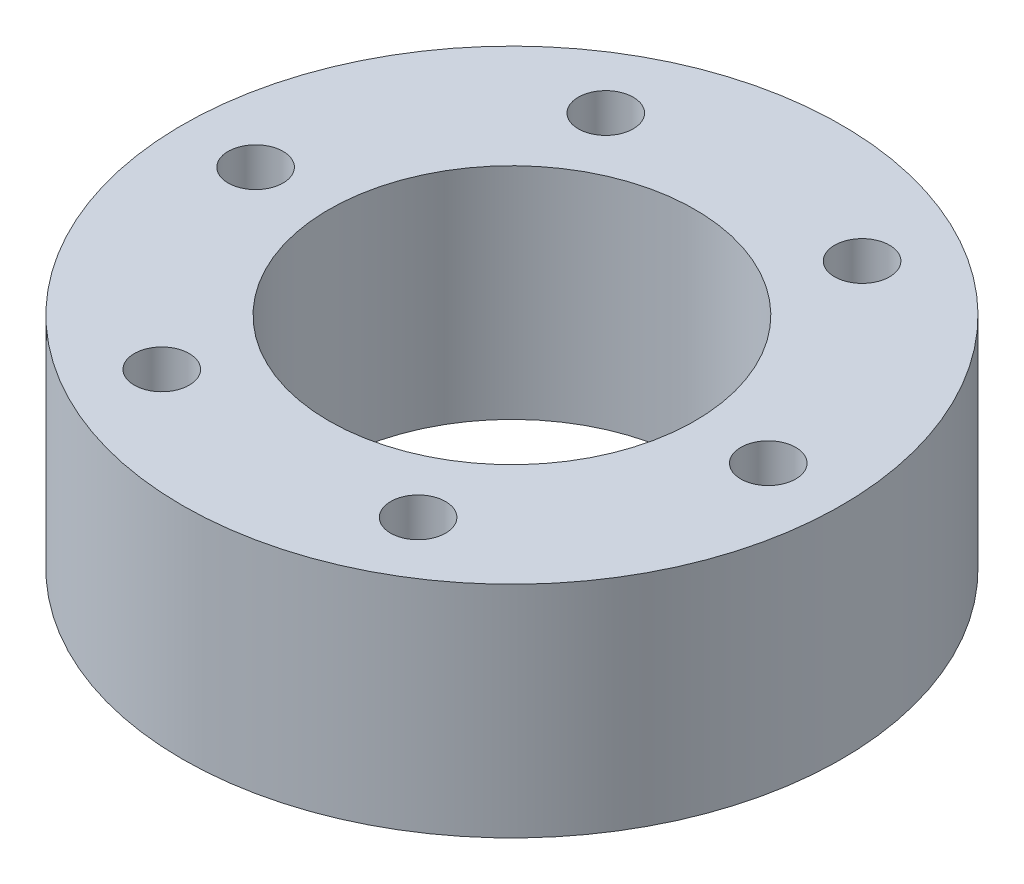
ISO-10303-21;
HEADER;
FILE_DESCRIPTION(('STEP AP214'),'2;1');
FILE_NAME('part.step','',(''),(''),'','','');
FILE_SCHEMA(('AUTOMOTIVE_DESIGN { 1 0 10303 214 1 1 1 1 }'));
ENDSEC;
DATA;
#1=APPLICATION_CONTEXT('core data for automotive mechanical design processes');
#2=APPLICATION_PROTOCOL_DEFINITION('international standard','automotive_design',2000,#1);
#3=PRODUCT_CONTEXT('',#1,'mechanical');
#4=PRODUCT('Part','Part','',(#3));
#5=PRODUCT_RELATED_PRODUCT_CATEGORY('part','',(#4));
#6=PRODUCT_DEFINITION_FORMATION('','',#4);
#7=PRODUCT_DEFINITION_CONTEXT('part definition',#1,'design');
#8=PRODUCT_DEFINITION('design','',#6,#7);
#9=PRODUCT_DEFINITION_SHAPE('','',#8);
#10=(LENGTH_UNIT() NAMED_UNIT(*) SI_UNIT(.MILLI.,.METRE.));
#11=(NAMED_UNIT(*) PLANE_ANGLE_UNIT() SI_UNIT($,.RADIAN.));
#12=(NAMED_UNIT(*) SI_UNIT($,.STERADIAN.) SOLID_ANGLE_UNIT());
#13=UNCERTAINTY_MEASURE_WITH_UNIT(LENGTH_MEASURE(1.E-05),#10,'distance_accuracy_value','');
#14=(GEOMETRIC_REPRESENTATION_CONTEXT(3) GLOBAL_UNCERTAINTY_ASSIGNED_CONTEXT((#13)) GLOBAL_UNIT_ASSIGNED_CONTEXT((#10,
#11,#12)) REPRESENTATION_CONTEXT('',''));
#15=CARTESIAN_POINT('',(0.,0.,0.));
#16=DIRECTION('',(0.,0.,1.));
#17=DIRECTION('',(1.,0.,0.));
#18=AXIS2_PLACEMENT_3D('',#15,#16,#17);
#19=CARTESIAN_POINT('',(0.,12.,0.));
#20=DIRECTION('',(0.,1.,0.));
#21=DIRECTION('',(0.,0.,1.));
#22=AXIS2_PLACEMENT_3D('',#19,#20,#21);
#23=PLANE('',#22);
#24=CARTESIAN_POINT('',(6.99999999999989,12.,12.1243556529822));
#25=DIRECTION('',(0.,1.,0.));
#26=DIRECTION('',(0.,0.,1.));
#27=AXIS2_PLACEMENT_3D('',#24,#25,#26);
#28=CIRCLE('',#27,1.5);
#29=CARTESIAN_POINT('',(6.99999999999989,12.,13.6243556529822));
#30=VERTEX_POINT('',#29);
#31=EDGE_CURVE('E76',#30,#30,#28,.T.);
#32=ORIENTED_EDGE('',*,*,#31,.F.);
#33=EDGE_LOOP('',(#32));
#34=FACE_BOUND('',#33,.T.);
#35=CARTESIAN_POINT('',(7.00000000000006,12.,-12.1243556529821));
#36=DIRECTION('',(0.,1.,0.));
#37=DIRECTION('',(0.,0.,1.));
#38=AXIS2_PLACEMENT_3D('',#35,#36,#37);
#39=CIRCLE('',#38,1.5);
#40=CARTESIAN_POINT('',(7.00000000000006,12.,-10.6243556529821));
#41=VERTEX_POINT('',#40);
#42=EDGE_CURVE('E64',#41,#41,#39,.T.);
#43=ORIENTED_EDGE('',*,*,#42,.F.);
#44=EDGE_LOOP('',(#43));
#45=FACE_BOUND('',#44,.T.);
#46=CARTESIAN_POINT('',(-14.,12.,0.));
#47=DIRECTION('',(0.,1.,0.));
#48=DIRECTION('',(0.,0.,1.));
#49=AXIS2_PLACEMENT_3D('',#46,#47,#48);
#50=CIRCLE('',#49,1.5);
#51=CARTESIAN_POINT('',(-14.,12.,1.5));
#52=VERTEX_POINT('',#51);
#53=EDGE_CURVE('E52',#52,#52,#50,.T.);
#54=ORIENTED_EDGE('',*,*,#53,.F.);
#55=EDGE_LOOP('',(#54));
#56=FACE_BOUND('',#55,.T.);
#57=CARTESIAN_POINT('',(0.,12.,0.));
#58=DIRECTION('',(0.,1.,0.));
#59=DIRECTION('',(0.,0.,1.));
#60=AXIS2_PLACEMENT_3D('',#57,#58,#59);
#61=CIRCLE('',#60,18.);
#62=CARTESIAN_POINT('',(0.,12.,18.));
#63=VERTEX_POINT('',#62);
#64=EDGE_CURVE('E10',#63,#63,#61,.T.);
#65=ORIENTED_EDGE('',*,*,#64,.T.);
#66=EDGE_LOOP('',(#65));
#67=FACE_BOUND('',#66,.T.);
#68=CARTESIAN_POINT('',(0.,12.,0.));
#69=DIRECTION('',(0.,1.,0.));
#70=DIRECTION('',(0.,0.,1.));
#71=AXIS2_PLACEMENT_3D('',#68,#69,#70);
#72=CIRCLE('',#71,10.);
#73=CARTESIAN_POINT('',(0.,12.,10.));
#74=VERTEX_POINT('',#73);
#75=EDGE_CURVE('E47',#74,#74,#72,.T.);
#76=ORIENTED_EDGE('',*,*,#75,.F.);
#77=EDGE_LOOP('',(#76));
#78=FACE_BOUND('',#77,.T.);
#79=CARTESIAN_POINT('',(-6.99999999999997,12.,-12.1243556529822));
#80=DIRECTION('',(0.,1.,0.));
#81=DIRECTION('',(0.,0.,1.));
#82=AXIS2_PLACEMENT_3D('',#79,#80,#81);
#83=CIRCLE('',#82,1.5);
#84=CARTESIAN_POINT('',(-6.99999999999997,12.,-10.6243556529822));
#85=VERTEX_POINT('',#84);
#86=EDGE_CURVE('E58',#85,#85,#83,.T.);
#87=ORIENTED_EDGE('',*,*,#86,.F.);
#88=EDGE_LOOP('',(#87));
#89=FACE_BOUND('',#88,.T.);
#90=CARTESIAN_POINT('',(14.,12.,0.));
#91=DIRECTION('',(0.,1.,0.));
#92=DIRECTION('',(0.,0.,1.));
#93=AXIS2_PLACEMENT_3D('',#90,#91,#92);
#94=CIRCLE('',#93,1.5);
#95=CARTESIAN_POINT('',(14.,12.,1.5000000000001));
#96=VERTEX_POINT('',#95);
#97=EDGE_CURVE('E70',#96,#96,#94,.T.);
#98=ORIENTED_EDGE('',*,*,#97,.F.);
#99=EDGE_LOOP('',(#98));
#100=FACE_BOUND('',#99,.T.);
#101=CARTESIAN_POINT('',(-7.00000000000014,12.,12.1243556529821));
#102=DIRECTION('',(0.,1.,0.));
#103=DIRECTION('',(0.,0.,1.));
#104=AXIS2_PLACEMENT_3D('',#101,#102,#103);
#105=CIRCLE('',#104,1.5);
#106=CARTESIAN_POINT('',(-7.00000000000014,12.,13.6243556529821));
#107=VERTEX_POINT('',#106);
#108=EDGE_CURVE('E82',#107,#107,#105,.T.);
#109=ORIENTED_EDGE('',*,*,#108,.F.);
#110=EDGE_LOOP('',(#109));
#111=FACE_BOUND('',#110,.T.);
#112=ADVANCED_FACE('F36',(#34,#45,#56,#67,#78,#89,#100,#111),#23,.T.);
#113=CARTESIAN_POINT('',(0.,0.,0.));
#114=DIRECTION('',(0.,1.,0.));
#115=DIRECTION('',(0.,0.,1.));
#116=AXIS2_PLACEMENT_3D('',#113,#114,#115);
#117=PLANE('',#116);
#118=CARTESIAN_POINT('',(0.,0.,0.));
#119=DIRECTION('',(0.,1.,0.));
#120=DIRECTION('',(0.,0.,1.));
#121=AXIS2_PLACEMENT_3D('',#118,#119,#120);
#122=CIRCLE('',#121,18.);
#123=CARTESIAN_POINT('',(0.,0.,18.));
#124=VERTEX_POINT('',#123);
#125=EDGE_CURVE('E40',#124,#124,#122,.T.);
#126=ORIENTED_EDGE('',*,*,#125,.F.);
#127=EDGE_LOOP('',(#126));
#128=FACE_BOUND('',#127,.T.);
#129=CARTESIAN_POINT('',(0.,0.,0.));
#130=DIRECTION('',(0.,1.,0.));
#131=DIRECTION('',(0.,0.,1.));
#132=AXIS2_PLACEMENT_3D('',#129,#130,#131);
#133=CIRCLE('',#132,10.);
#134=CARTESIAN_POINT('',(0.,0.,10.));
#135=VERTEX_POINT('',#134);
#136=EDGE_CURVE('E49',#135,#135,#133,.T.);
#137=ORIENTED_EDGE('',*,*,#136,.T.);
#138=EDGE_LOOP('',(#137));
#139=FACE_BOUND('',#138,.T.);
#140=CARTESIAN_POINT('',(-14.,0.,0.));
#141=DIRECTION('',(0.,1.,0.));
#142=DIRECTION('',(0.,0.,1.));
#143=AXIS2_PLACEMENT_3D('',#140,#141,#142);
#144=CIRCLE('',#143,1.5);
#145=CARTESIAN_POINT('',(-14.,0.,1.5));
#146=VERTEX_POINT('',#145);
#147=EDGE_CURVE('E55',#146,#146,#144,.T.);
#148=ORIENTED_EDGE('',*,*,#147,.T.);
#149=EDGE_LOOP('',(#148));
#150=FACE_BOUND('',#149,.T.);
#151=CARTESIAN_POINT('',(-6.99999999999997,0.,-12.1243556529822));
#152=DIRECTION('',(0.,1.,0.));
#153=DIRECTION('',(0.,0.,1.));
#154=AXIS2_PLACEMENT_3D('',#151,#152,#153);
#155=CIRCLE('',#154,1.5);
#156=CARTESIAN_POINT('',(-6.99999999999997,0.,-10.6243556529822));
#157=VERTEX_POINT('',#156);
#158=EDGE_CURVE('E61',#157,#157,#155,.T.);
#159=ORIENTED_EDGE('',*,*,#158,.T.);
#160=EDGE_LOOP('',(#159));
#161=FACE_BOUND('',#160,.T.);
#162=CARTESIAN_POINT('',(7.00000000000006,0.,-12.1243556529821));
#163=DIRECTION('',(0.,1.,0.));
#164=DIRECTION('',(0.,0.,1.));
#165=AXIS2_PLACEMENT_3D('',#162,#163,#164);
#166=CIRCLE('',#165,1.5);
#167=CARTESIAN_POINT('',(7.00000000000006,0.,-10.6243556529821));
#168=VERTEX_POINT('',#167);
#169=EDGE_CURVE('E67',#168,#168,#166,.T.);
#170=ORIENTED_EDGE('',*,*,#169,.T.);
#171=EDGE_LOOP('',(#170));
#172=FACE_BOUND('',#171,.T.);
#173=CARTESIAN_POINT('',(14.,0.,0.));
#174=DIRECTION('',(0.,1.,0.));
#175=DIRECTION('',(0.,0.,1.));
#176=AXIS2_PLACEMENT_3D('',#173,#174,#175);
#177=CIRCLE('',#176,1.5);
#178=CARTESIAN_POINT('',(14.,0.,1.5000000000001));
#179=VERTEX_POINT('',#178);
#180=EDGE_CURVE('E73',#179,#179,#177,.T.);
#181=ORIENTED_EDGE('',*,*,#180,.T.);
#182=EDGE_LOOP('',(#181));
#183=FACE_BOUND('',#182,.T.);
#184=CARTESIAN_POINT('',(6.99999999999989,0.,12.1243556529822));
#185=DIRECTION('',(0.,1.,0.));
#186=DIRECTION('',(0.,0.,1.));
#187=AXIS2_PLACEMENT_3D('',#184,#185,#186);
#188=CIRCLE('',#187,1.5);
#189=CARTESIAN_POINT('',(6.99999999999989,0.,13.6243556529822));
#190=VERTEX_POINT('',#189);
#191=EDGE_CURVE('E79',#190,#190,#188,.T.);
#192=ORIENTED_EDGE('',*,*,#191,.T.);
#193=EDGE_LOOP('',(#192));
#194=FACE_BOUND('',#193,.T.);
#195=CARTESIAN_POINT('',(-7.00000000000014,0.,12.1243556529821));
#196=DIRECTION('',(0.,1.,0.));
#197=DIRECTION('',(0.,0.,1.));
#198=AXIS2_PLACEMENT_3D('',#195,#196,#197);
#199=CIRCLE('',#198,1.5);
#200=CARTESIAN_POINT('',(-7.00000000000014,0.,13.6243556529821));
#201=VERTEX_POINT('',#200);
#202=EDGE_CURVE('E85',#201,#201,#199,.T.);
#203=ORIENTED_EDGE('',*,*,#202,.T.);
#204=EDGE_LOOP('',(#203));
#205=FACE_BOUND('',#204,.T.);
#206=ADVANCED_FACE('F95',(#128,#139,#150,#161,#172,#183,#194,#205),#117,.F.);
#207=CARTESIAN_POINT('',(0.,12.,0.));
#208=DIRECTION('',(0.,-1.,0.));
#209=DIRECTION('',(0.,0.,-1.));
#210=AXIS2_PLACEMENT_3D('',#207,#208,#209);
#211=CYLINDRICAL_SURFACE('',#210,18.);
#212=ORIENTED_EDGE('',*,*,#64,.F.);
#213=EDGE_LOOP('',(#212));
#214=FACE_BOUND('',#213,.T.);
#215=ORIENTED_EDGE('',*,*,#125,.T.);
#216=EDGE_LOOP('',(#215));
#217=FACE_BOUND('',#216,.T.);
#218=ADVANCED_FACE('F38',(#214,#217),#211,.T.);
#219=CARTESIAN_POINT('',(0.,12.,0.));
#220=DIRECTION('',(0.,-1.,0.));
#221=DIRECTION('',(0.,0.,-1.));
#222=AXIS2_PLACEMENT_3D('',#219,#220,#221);
#223=CYLINDRICAL_SURFACE('',#222,10.);
#224=ORIENTED_EDGE('',*,*,#75,.T.);
#225=EDGE_LOOP('',(#224));
#226=FACE_BOUND('',#225,.T.);
#227=ORIENTED_EDGE('',*,*,#136,.F.);
#228=EDGE_LOOP('',(#227));
#229=FACE_BOUND('',#228,.T.);
#230=ADVANCED_FACE('F105',(#226,#229),#223,.F.);
#231=CARTESIAN_POINT('',(-14.,12.,0.));
#232=DIRECTION('',(0.,-1.,0.));
#233=DIRECTION('',(0.,0.,-1.));
#234=AXIS2_PLACEMENT_3D('',#231,#232,#233);
#235=CYLINDRICAL_SURFACE('',#234,1.5);
#236=ORIENTED_EDGE('',*,*,#53,.T.);
#237=EDGE_LOOP('',(#236));
#238=FACE_BOUND('',#237,.T.);
#239=ORIENTED_EDGE('',*,*,#147,.F.);
#240=EDGE_LOOP('',(#239));
#241=FACE_BOUND('',#240,.T.);
#242=ADVANCED_FACE('F108',(#238,#241),#235,.F.);
#243=CARTESIAN_POINT('',(-6.99999999999997,12.,-12.1243556529822));
#244=DIRECTION('',(0.,-1.,0.));
#245=DIRECTION('',(0.,0.,-1.));
#246=AXIS2_PLACEMENT_3D('',#243,#244,#245);
#247=CYLINDRICAL_SURFACE('',#246,1.5);
#248=ORIENTED_EDGE('',*,*,#86,.T.);
#249=EDGE_LOOP('',(#248));
#250=FACE_BOUND('',#249,.T.);
#251=ORIENTED_EDGE('',*,*,#158,.F.);
#252=EDGE_LOOP('',(#251));
#253=FACE_BOUND('',#252,.T.);
#254=ADVANCED_FACE('F112',(#250,#253),#247,.F.);
#255=CARTESIAN_POINT('',(7.00000000000006,12.,-12.1243556529821));
#256=DIRECTION('',(0.,-1.,0.));
#257=DIRECTION('',(0.,0.,-1.));
#258=AXIS2_PLACEMENT_3D('',#255,#256,#257);
#259=CYLINDRICAL_SURFACE('',#258,1.5);
#260=ORIENTED_EDGE('',*,*,#42,.T.);
#261=EDGE_LOOP('',(#260));
#262=FACE_BOUND('',#261,.T.);
#263=ORIENTED_EDGE('',*,*,#169,.F.);
#264=EDGE_LOOP('',(#263));
#265=FACE_BOUND('',#264,.T.);
#266=ADVANCED_FACE('F116',(#262,#265),#259,.F.);
#267=CARTESIAN_POINT('',(14.,12.,0.));
#268=DIRECTION('',(0.,-1.,0.));
#269=DIRECTION('',(0.,0.,-1.));
#270=AXIS2_PLACEMENT_3D('',#267,#268,#269);
#271=CYLINDRICAL_SURFACE('',#270,1.5);
#272=ORIENTED_EDGE('',*,*,#97,.T.);
#273=EDGE_LOOP('',(#272));
#274=FACE_BOUND('',#273,.T.);
#275=ORIENTED_EDGE('',*,*,#180,.F.);
#276=EDGE_LOOP('',(#275));
#277=FACE_BOUND('',#276,.T.);
#278=ADVANCED_FACE('F120',(#274,#277),#271,.F.);
#279=CARTESIAN_POINT('',(6.99999999999989,12.,12.1243556529822));
#280=DIRECTION('',(0.,-1.,0.));
#281=DIRECTION('',(0.,0.,-1.));
#282=AXIS2_PLACEMENT_3D('',#279,#280,#281);
#283=CYLINDRICAL_SURFACE('',#282,1.5);
#284=ORIENTED_EDGE('',*,*,#31,.T.);
#285=EDGE_LOOP('',(#284));
#286=FACE_BOUND('',#285,.T.);
#287=ORIENTED_EDGE('',*,*,#191,.F.);
#288=EDGE_LOOP('',(#287));
#289=FACE_BOUND('',#288,.T.);
#290=ADVANCED_FACE('F124',(#286,#289),#283,.F.);
#291=CARTESIAN_POINT('',(-7.00000000000014,12.,12.1243556529821));
#292=DIRECTION('',(0.,-1.,0.));
#293=DIRECTION('',(0.,0.,-1.));
#294=AXIS2_PLACEMENT_3D('',#291,#292,#293);
#295=CYLINDRICAL_SURFACE('',#294,1.5);
#296=ORIENTED_EDGE('',*,*,#108,.T.);
#297=EDGE_LOOP('',(#296));
#298=FACE_BOUND('',#297,.T.);
#299=ORIENTED_EDGE('',*,*,#202,.F.);
#300=EDGE_LOOP('',(#299));
#301=FACE_BOUND('',#300,.T.);
#302=ADVANCED_FACE('F91',(#298,#301),#295,.F.);
#303=CLOSED_SHELL('',(#112,#206,#218,#230,#242,#254,#266,#278,#290,#302));
#304=MANIFOLD_SOLID_BREP('B2',#303);
#305=ADVANCED_BREP_SHAPE_REPRESENTATION('',(#18,#304),#14);
#306=SHAPE_DEFINITION_REPRESENTATION(#9,#305);
ENDSEC;
END-ISO-10303-21;
